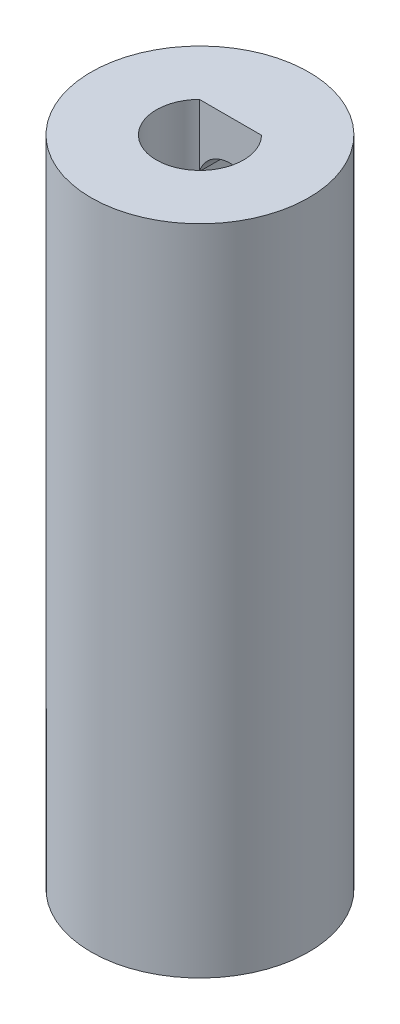
ISO-10303-21;
HEADER;
FILE_DESCRIPTION(('STEP AP214'),'2;1');
FILE_NAME('part.step','',(''),(''),'','','');
FILE_SCHEMA(('AUTOMOTIVE_DESIGN { 1 0 10303 214 1 1 1 1 }'));
ENDSEC;
DATA;
#1=APPLICATION_CONTEXT('core data for automotive mechanical design processes');
#2=APPLICATION_PROTOCOL_DEFINITION('international standard','automotive_design',2000,#1);
#3=PRODUCT_CONTEXT('',#1,'mechanical');
#4=PRODUCT('Part','Part','',(#3));
#5=PRODUCT_RELATED_PRODUCT_CATEGORY('part','',(#4));
#6=PRODUCT_DEFINITION_FORMATION('','',#4);
#7=PRODUCT_DEFINITION_CONTEXT('part definition',#1,'design');
#8=PRODUCT_DEFINITION('design','',#6,#7);
#9=PRODUCT_DEFINITION_SHAPE('','',#8);
#10=(LENGTH_UNIT() NAMED_UNIT(*) SI_UNIT(.MILLI.,.METRE.));
#11=(NAMED_UNIT(*) PLANE_ANGLE_UNIT() SI_UNIT($,.RADIAN.));
#12=(NAMED_UNIT(*) SI_UNIT($,.STERADIAN.) SOLID_ANGLE_UNIT());
#13=UNCERTAINTY_MEASURE_WITH_UNIT(LENGTH_MEASURE(1.E-05),#10,'distance_accuracy_value','');
#14=(GEOMETRIC_REPRESENTATION_CONTEXT(3) GLOBAL_UNCERTAINTY_ASSIGNED_CONTEXT((#13)) GLOBAL_UNIT_ASSIGNED_CONTEXT((#10,
#11,#12)) REPRESENTATION_CONTEXT('',''));
#15=CARTESIAN_POINT('',(0.,0.,0.));
#16=DIRECTION('',(0.,0.,1.));
#17=DIRECTION('',(1.,0.,0.));
#18=AXIS2_PLACEMENT_3D('',#15,#16,#17);
#19=CARTESIAN_POINT('',(0.,0.,-1.4));
#20=DIRECTION('',(0.,0.,1.));
#21=DIRECTION('',(1.,0.,0.));
#22=AXIS2_PLACEMENT_3D('',#19,#20,#21);
#23=PLANE('',#22);
#24=CARTESIAN_POINT('',(0.,26.6692047122861,-1.4));
#25=DIRECTION('',(0.,0.,1.));
#26=DIRECTION('',(1.,0.,0.));
#27=AXIS2_PLACEMENT_3D('',#24,#25,#26);
#28=CIRCLE('',#27,1.5);
#29=CARTESIAN_POINT('',(-1.42828568570857,26.2109471427905,-1.4));
#30=VERTEX_POINT('',#29);
#31=CARTESIAN_POINT('',(1.42828568570857,26.2109471427905,-1.4));
#32=VERTEX_POINT('',#31);
#33=EDGE_CURVE('E108',#30,#32,#28,.T.);
#34=ORIENTED_EDGE('',*,*,#33,.F.);
#35=DIRECTION('',(0.,1.,0.));
#36=VECTOR('',#35,1.);
#37=CARTESIAN_POINT('',(-1.42828568570857,0.,-1.4));
#38=LINE('',#37,#36);
#39=CARTESIAN_POINT('',(-1.42828568570857,0.,-1.4));
#40=VERTEX_POINT('',#39);
#41=EDGE_CURVE('E196',#40,#30,#38,.T.);
#42=ORIENTED_EDGE('',*,*,#41,.F.);
#43=DIRECTION('',(1.,0.,0.));
#44=VECTOR('',#43,1.);
#45=CARTESIAN_POINT('',(0.,0.,-1.4));
#46=LINE('',#45,#44);
#47=CARTESIAN_POINT('',(1.42828568570857,0.,-1.4));
#48=VERTEX_POINT('',#47);
#49=EDGE_CURVE('E216',#40,#48,#46,.T.);
#50=ORIENTED_EDGE('',*,*,#49,.T.);
#51=DIRECTION('',(0.,1.,0.));
#52=VECTOR('',#51,1.);
#53=CARTESIAN_POINT('',(1.42828568570857,0.,-1.4));
#54=LINE('',#53,#52);
#55=EDGE_CURVE('E198',#48,#32,#54,.T.);
#56=ORIENTED_EDGE('',*,*,#55,.T.);
#57=EDGE_LOOP('',(#34,#42,#50,#56));
#58=FACE_BOUND('',#57,.T.);
#59=ADVANCED_FACE('F45',(#58),#23,.T.);
#60=CARTESIAN_POINT('',(0.,30.,0.));
#61=DIRECTION('',(0.,-1.,0.));
#62=DIRECTION('',(0.,0.,-1.));
#63=AXIS2_PLACEMENT_3D('',#60,#61,#62);
#64=CYLINDRICAL_SURFACE('',#63,5.);
#65=CARTESIAN_POINT('',(1.42828568570857,26.2109471427905,-4.79165942028437));
#66=CARTESIAN_POINT('',(1.41532086952665,26.1705391653264,-4.79552145997788));
#67=CARTESIAN_POINT('',(1.40066067903154,26.1307439398568,-4.79983662152926));
#68=CARTESIAN_POINT('',(1.36807036176014,26.0526207136702,-4.80922828737008));
#69=CARTESIAN_POINT('',(1.35014109854961,26.0142923286967,-4.81430459053184));
#70=CARTESIAN_POINT('',(1.29170054599167,25.9019946025929,-4.83043898220411));
#71=CARTESIAN_POINT('',(1.24648142779986,25.8305422753068,-4.84241986157132));
#72=CARTESIAN_POINT('',(1.14488022710476,25.6964065708847,-4.86744056186554));
#73=CARTESIAN_POINT('',(1.08850299972657,25.6337194000205,-4.88047992077565));
#74=CARTESIAN_POINT('',(0.966002047538882,25.5185955596391,-4.90619515458798));
#75=CARTESIAN_POINT('',(0.899876843650885,25.4661604484995,-4.91887097398041));
#76=CARTESIAN_POINT('',(0.758581148789905,25.3723452937152,-4.94264604117125));
#77=CARTESIAN_POINT('',(0.683298525900501,25.3311276223409,-4.95372114501679));
#78=CARTESIAN_POINT('',(0.526479688668817,25.2620246788735,-4.97283095910141));
#79=CARTESIAN_POINT('',(0.444944593288869,25.2341370276296,-4.98086621184175));
#80=CARTESIAN_POINT('',(0.280381908805703,25.193274739882,-4.99279445763981));
#81=CARTESIAN_POINT('',(0.197461577395029,25.1799010129168,-4.99679807180051));
#82=CARTESIAN_POINT('',(0.0304659141714283,25.1671794327191,-5.00060404382434));
#83=CARTESIAN_POINT('',(-0.0536091366120107,25.1678282251574,-5.00040740643043));
#84=CARTESIAN_POINT('',(-0.217666675765226,25.1828702942957,-4.99591272381006));
#85=CARTESIAN_POINT('',(-0.297693890851032,25.1968215697753,-4.99174657660499));
#86=CARTESIAN_POINT('',(-0.454211764306284,25.2373430500535,-4.97994525011857));
#87=CARTESIAN_POINT('',(-0.530702260612382,25.2639138324893,-4.97230991204141));
#88=CARTESIAN_POINT('',(-0.678973505373156,25.3291931712204,-4.95425471734346));
#89=CARTESIAN_POINT('',(-0.750692666240752,25.3680329757042,-4.94380494026372));
#90=CARTESIAN_POINT('',(-0.88674959128624,25.4566575195405,-4.92122333442324));
#91=CARTESIAN_POINT('',(-0.951084081152311,25.5064470856296,-4.90909076474877));
#92=CARTESIAN_POINT('',(-1.07317331059456,25.6178276925028,-4.88388570248044));
#93=CARTESIAN_POINT('',(-1.13057312751665,25.6798035745167,-4.87079500680452));
#94=CARTESIAN_POINT('',(-1.23421512254996,25.8125894471405,-4.84557141891695));
#95=CARTESIAN_POINT('',(-1.28046900732324,25.883390049402,-4.83343753085693));
#96=CARTESIAN_POINT('',(-1.34225855491378,25.998046379778,-4.81651873666881));
#97=CARTESIAN_POINT('',(-1.36218461691526,26.0394693978725,-4.81090552773059));
#98=CARTESIAN_POINT('',(-1.39816471282082,26.1240053124375,-4.80057050874069));
#99=CARTESIAN_POINT('',(-1.4142237736363,26.1671159293775,-4.79584754317136));
#100=CARTESIAN_POINT('',(-1.42828568570857,26.2109471427905,-4.79165942028437));
#101=B_SPLINE_CURVE_WITH_KNOTS('',3,(#65,#66,#67,#68,#69,#70,#71,#72,#73,#74,#75,#76,#77,#78,
#79,#80,#81,#82,#83,#84,#85,#86,#87,#88,#89,#90,#91,#92,#93,#94,#95,#96,#97,#98,#99,#100),
.UNSPECIFIED.,.F.,.F.,(4,2,2,2,2,2,2,2,2,2,2,2,2,2,2,2,2,4),(0.,0.127750640272878,
0.255467582407862,0.510368744181928,0.765159236043947,1.01998842760596,1.27833072738271,
1.53662690081808,1.78762516381199,2.038563386137,2.28144403871632,2.52433580982782,
2.76991931923274,3.01561130144124,3.27089500582826,3.52590940347394,3.6646536494105,
3.80321654901352),.UNSPECIFIED.);
#102=CARTESIAN_POINT('',(1.42828568570857,26.2109471427905,-4.79165942028437));
#103=VERTEX_POINT('',#102);
#104=CARTESIAN_POINT('',(-1.42828568570857,26.2109471427905,-4.79165942028437));
#105=VERTEX_POINT('',#104);
#106=EDGE_CURVE('E120',#103,#105,#101,.T.);
#107=ORIENTED_EDGE('',*,*,#106,.F.);
#108=DIRECTION('',(0.,-1.,0.));
#109=VECTOR('',#108,1.);
#110=CARTESIAN_POINT('',(1.42828568570857,30.,-4.79165942028437));
#111=LINE('',#110,#109);
#112=CARTESIAN_POINT('',(1.42828568570857,27.1274622817817,-4.79165942028437));
#113=VERTEX_POINT('',#112);
#114=EDGE_CURVE('E101',#113,#103,#111,.T.);
#115=ORIENTED_EDGE('',*,*,#114,.F.);
#116=CARTESIAN_POINT('',(-1.42828568570857,27.1274622817817,-4.79165942028437));
#117=CARTESIAN_POINT('',(-1.41532086952665,27.1678702592459,-4.79552145997788));
#118=CARTESIAN_POINT('',(-1.40066067903154,27.2076654847154,-4.79983662152926));
#119=CARTESIAN_POINT('',(-1.36807036176014,27.285788710902,-4.80922828737008));
#120=CARTESIAN_POINT('',(-1.35014109854961,27.3241170958755,-4.81430459053184));
#121=CARTESIAN_POINT('',(-1.29170054599167,27.4364148219794,-4.83043898220411));
#122=CARTESIAN_POINT('',(-1.24648142779986,27.5078671492654,-4.84241986157132));
#123=CARTESIAN_POINT('',(-1.14488022710476,27.6420028536875,-4.86744056186553));
#124=CARTESIAN_POINT('',(-1.08850299972657,27.7046900245517,-4.88047992077564));
#125=CARTESIAN_POINT('',(-0.966002047538883,27.8198138649331,-4.90619515458798));
#126=CARTESIAN_POINT('',(-0.899876843650886,27.8722489760728,-4.91887097398041));
#127=CARTESIAN_POINT('',(-0.758581148789906,27.966064130857,-4.94264604117125));
#128=CARTESIAN_POINT('',(-0.683298525900503,28.0072818022314,-4.95372114501679));
#129=CARTESIAN_POINT('',(-0.52647968866882,28.0763847456987,-4.97283095910141));
#130=CARTESIAN_POINT('',(-0.444944593288873,28.1042723969427,-4.98086621184175));
#131=CARTESIAN_POINT('',(-0.280381908805708,28.1451346846903,-4.99279445763981));
#132=CARTESIAN_POINT('',(-0.197461577395034,28.1585084116554,-4.99679807180051));
#133=CARTESIAN_POINT('',(-0.0304659141714334,28.1712299918532,-5.00060404382434));
#134=CARTESIAN_POINT('',(0.0536091366120056,28.1705811994148,-5.00040740643043));
#135=CARTESIAN_POINT('',(0.21766667576522,28.1555391302765,-4.99591272381006));
#136=CARTESIAN_POINT('',(0.297693890851026,28.141587854797,-4.99174657660499));
#137=CARTESIAN_POINT('',(0.454211764306279,28.1010663745187,-4.97994525011857));
#138=CARTESIAN_POINT('',(0.530702260612376,28.0744955920829,-4.97230991204141));
#139=CARTESIAN_POINT('',(0.678973505373151,28.0092162533519,-4.95425471734346));
#140=CARTESIAN_POINT('',(0.750692666240747,27.9703764488681,-4.94380494026372));
#141=CARTESIAN_POINT('',(0.886749591286235,27.8817519050317,-4.92122333442324));
#142=CARTESIAN_POINT('',(0.951084081152306,27.8319623389427,-4.90909076474877));
#143=CARTESIAN_POINT('',(1.07317331059455,27.7205817320694,-4.88388570248044));
#144=CARTESIAN_POINT('',(1.13057312751664,27.6586058500556,-4.87079500680452));
#145=CARTESIAN_POINT('',(1.23421512254996,27.5258199774318,-4.84557141891695));
#146=CARTESIAN_POINT('',(1.28046900732324,27.4550193751703,-4.83343753085693));
#147=CARTESIAN_POINT('',(1.34225855491378,27.3403630447943,-4.81651873666881));
#148=CARTESIAN_POINT('',(1.36218461691526,27.2989400266998,-4.81090552773059));
#149=CARTESIAN_POINT('',(1.39816471282082,27.2144041121348,-4.80057050874069));
#150=CARTESIAN_POINT('',(1.4142237736363,27.1712934951948,-4.79584754317136));
#151=CARTESIAN_POINT('',(1.42828568570857,27.1274622817817,-4.79165942028437));
#152=B_SPLINE_CURVE_WITH_KNOTS('',3,(#116,#117,#118,#119,#120,#121,#122,#123,#124,#125,#126,
#127,#128,#129,#130,#131,#132,#133,#134,#135,#136,#137,#138,#139,#140,#141,#142,#143,#144,#145,
#146,#147,#148,#149,#150,#151),.UNSPECIFIED.,.F.,.F.,(4,2,2,2,2,2,2,2,2,2,2,2,2,2,2,2,2,4),(0.,
0.127750640272875,0.255467582407862,0.510368744181924,0.765159236043946,1.01998842760596,
1.27833072738271,1.53662690081808,1.78762516381199,2.03856338613699,2.28144403871631,
2.52433580982782,2.76991931923273,3.01561130144124,3.27089500582826,3.52590940347394,
3.6646536494105,3.80321654901352),.UNSPECIFIED.);
#153=CARTESIAN_POINT('',(-1.42828568570857,27.1274622817817,-4.79165942028437));
#154=VERTEX_POINT('',#153);
#155=EDGE_CURVE('E111',#154,#113,#152,.T.);
#156=ORIENTED_EDGE('',*,*,#155,.F.);
#157=DIRECTION('',(0.,-1.,0.));
#158=VECTOR('',#157,1.);
#159=CARTESIAN_POINT('',(-1.42828568570857,30.,-4.79165942028437));
#160=LINE('',#159,#158);
#161=EDGE_CURVE('E61',#105,#154,#160,.F.);
#162=ORIENTED_EDGE('',*,*,#161,.F.);
#163=EDGE_LOOP('',(#107,#115,#156,#162));
#164=FACE_BOUND('',#163,.T.);
#165=CARTESIAN_POINT('',(0.,30.,0.));
#166=DIRECTION('',(0.,1.,0.));
#167=DIRECTION('',(0.,0.,1.));
#168=AXIS2_PLACEMENT_3D('',#165,#166,#167);
#169=CIRCLE('',#168,5.);
#170=CARTESIAN_POINT('',(0.,30.,5.));
#171=VERTEX_POINT('',#170);
#172=EDGE_CURVE('E11',#171,#171,#169,.T.);
#173=ORIENTED_EDGE('',*,*,#172,.F.);
#174=EDGE_LOOP('',(#173));
#175=FACE_BOUND('',#174,.T.);
#176=CARTESIAN_POINT('',(0.,0.,0.));
#177=DIRECTION('',(0.,1.,0.));
#178=DIRECTION('',(0.,0.,1.));
#179=AXIS2_PLACEMENT_3D('',#176,#177,#178);
#180=CIRCLE('',#179,5.);
#181=CARTESIAN_POINT('',(0.,0.,5.));
#182=VERTEX_POINT('',#181);
#183=EDGE_CURVE('E49',#182,#182,#180,.T.);
#184=ORIENTED_EDGE('',*,*,#183,.T.);
#185=EDGE_LOOP('',(#184));
#186=FACE_BOUND('',#185,.T.);
#187=ADVANCED_FACE('F47',(#164,#175,#186),#64,.T.);
#188=CARTESIAN_POINT('',(0.,30.,0.));
#189=DIRECTION('',(0.,1.,0.));
#190=DIRECTION('',(0.,0.,1.));
#191=AXIS2_PLACEMENT_3D('',#188,#189,#190);
#192=PLANE('',#191);
#193=CARTESIAN_POINT('',(0.,30.,0.));
#194=DIRECTION('',(0.,1.,0.));
#195=DIRECTION('',(0.,0.,1.));
#196=AXIS2_PLACEMENT_3D('',#193,#194,#195);
#197=CIRCLE('',#196,2.);
#198=CARTESIAN_POINT('',(-1.42828568570857,30.,-1.4));
#199=VERTEX_POINT('',#198);
#200=CARTESIAN_POINT('',(1.42828568570857,30.,-1.4));
#201=VERTEX_POINT('',#200);
#202=EDGE_CURVE('E115',#199,#201,#197,.T.);
#203=ORIENTED_EDGE('',*,*,#202,.F.);
#204=DIRECTION('',(1.,0.,0.));
#205=VECTOR('',#204,1.);
#206=CARTESIAN_POINT('',(0.,30.,-1.4));
#207=LINE('',#206,#205);
#208=EDGE_CURVE('E211',#199,#201,#207,.T.);
#209=ORIENTED_EDGE('',*,*,#208,.T.);
#210=EDGE_LOOP('',(#203,#209));
#211=FACE_BOUND('',#210,.T.);
#212=ORIENTED_EDGE('',*,*,#172,.T.);
#213=EDGE_LOOP('',(#212));
#214=FACE_BOUND('',#213,.T.);
#215=ADVANCED_FACE('F177',(#211,#214),#192,.T.);
#216=CARTESIAN_POINT('',(0.,0.,0.));
#217=DIRECTION('',(0.,1.,0.));
#218=DIRECTION('',(0.,0.,1.));
#219=AXIS2_PLACEMENT_3D('',#216,#217,#218);
#220=PLANE('',#219);
#221=ORIENTED_EDGE('',*,*,#49,.F.);
#222=CARTESIAN_POINT('',(0.,0.,0.));
#223=DIRECTION('',(0.,1.,0.));
#224=DIRECTION('',(0.,0.,1.));
#225=AXIS2_PLACEMENT_3D('',#222,#223,#224);
#226=CIRCLE('',#225,2.);
#227=EDGE_CURVE('E153',#40,#48,#226,.T.);
#228=ORIENTED_EDGE('',*,*,#227,.T.);
#229=EDGE_LOOP('',(#221,#228));
#230=FACE_BOUND('',#229,.T.);
#231=ORIENTED_EDGE('',*,*,#183,.F.);
#232=EDGE_LOOP('',(#231));
#233=FACE_BOUND('',#232,.T.);
#234=ADVANCED_FACE('F175',(#230,#233),#220,.F.);
#235=CARTESIAN_POINT('',(0.,0.,0.));
#236=DIRECTION('',(0.,1.,0.));
#237=DIRECTION('',(0.,0.,1.));
#238=AXIS2_PLACEMENT_3D('',#235,#236,#237);
#239=CYLINDRICAL_SURFACE('',#238,2.);
#240=ORIENTED_EDGE('',*,*,#202,.T.);
#241=CARTESIAN_POINT('',(1.42828568570857,27.1274622817817,-1.4));
#242=VERTEX_POINT('',#241);
#243=EDGE_CURVE('E214',#242,#201,#54,.T.);
#244=ORIENTED_EDGE('',*,*,#243,.F.);
#245=DIRECTION('',(0.,1.,0.));
#246=VECTOR('',#245,1.);
#247=CARTESIAN_POINT('',(1.42828568570857,0.,-1.4));
#248=LINE('',#247,#246);
#249=EDGE_CURVE('E69',#32,#242,#248,.T.);
#250=ORIENTED_EDGE('',*,*,#249,.F.);
#251=ORIENTED_EDGE('',*,*,#55,.F.);
#252=ORIENTED_EDGE('',*,*,#227,.F.);
#253=ORIENTED_EDGE('',*,*,#41,.T.);
#254=DIRECTION('',(0.,-1.,0.));
#255=VECTOR('',#254,1.);
#256=CARTESIAN_POINT('',(-1.42828568570857,0.,-1.4));
#257=LINE('',#256,#255);
#258=CARTESIAN_POINT('',(-1.42828568570857,27.1274622817817,-1.4));
#259=VERTEX_POINT('',#258);
#260=EDGE_CURVE('E138',#259,#30,#257,.T.);
#261=ORIENTED_EDGE('',*,*,#260,.F.);
#262=EDGE_CURVE('E204',#259,#199,#38,.T.);
#263=ORIENTED_EDGE('',*,*,#262,.T.);
#264=EDGE_LOOP('',(#240,#244,#250,#251,#252,#253,#261,#263));
#265=FACE_BOUND('',#264,.T.);
#266=ADVANCED_FACE('F171',(#265),#239,.F.);
#267=EDGE_CURVE('E125',#242,#259,#28,.T.);
#268=ORIENTED_EDGE('',*,*,#267,.F.);
#269=ORIENTED_EDGE('',*,*,#243,.T.);
#270=ORIENTED_EDGE('',*,*,#208,.F.);
#271=ORIENTED_EDGE('',*,*,#262,.F.);
#272=EDGE_LOOP('',(#268,#269,#270,#271));
#273=FACE_BOUND('',#272,.T.);
#274=ADVANCED_FACE('F168',(#273),#23,.T.);
#275=CARTESIAN_POINT('',(1.42828568570857,0.,-5.001));
#276=DIRECTION('',(1.,0.,0.));
#277=DIRECTION('',(0.,0.,-1.));
#278=AXIS2_PLACEMENT_3D('',#275,#276,#277);
#279=PLANE('',#278);
#280=ORIENTED_EDGE('',*,*,#114,.T.);
#281=DIRECTION('',(0.,0.,1.));
#282=VECTOR('',#281,1.);
#283=CARTESIAN_POINT('',(1.42828568570857,26.2109471427905,-5.001));
#284=LINE('',#283,#282);
#285=EDGE_CURVE('E116',#103,#32,#284,.T.);
#286=ORIENTED_EDGE('',*,*,#285,.T.);
#287=ORIENTED_EDGE('',*,*,#249,.T.);
#288=DIRECTION('',(0.,0.,1.));
#289=VECTOR('',#288,1.);
#290=CARTESIAN_POINT('',(1.42828568570857,27.1274622817817,-5.001));
#291=LINE('',#290,#289);
#292=EDGE_CURVE('E97',#113,#242,#291,.T.);
#293=ORIENTED_EDGE('',*,*,#292,.F.);
#294=EDGE_LOOP('',(#280,#286,#287,#293));
#295=FACE_BOUND('',#294,.T.);
#296=ADVANCED_FACE('F99',(#295),#279,.F.);
#297=CARTESIAN_POINT('',(0.,26.6692047122861,-5.001));
#298=DIRECTION('',(0.,0.,1.));
#299=DIRECTION('',(1.,0.,0.));
#300=AXIS2_PLACEMENT_3D('',#297,#298,#299);
#301=CYLINDRICAL_SURFACE('',#300,1.5);
#302=ORIENTED_EDGE('',*,*,#106,.T.);
#303=DIRECTION('',(0.,0.,1.));
#304=VECTOR('',#303,1.);
#305=CARTESIAN_POINT('',(-1.42828568570857,26.2109471427905,-5.001));
#306=LINE('',#305,#304);
#307=EDGE_CURVE('E144',#105,#30,#306,.T.);
#308=ORIENTED_EDGE('',*,*,#307,.T.);
#309=ORIENTED_EDGE('',*,*,#33,.T.);
#310=ORIENTED_EDGE('',*,*,#285,.F.);
#311=EDGE_LOOP('',(#302,#308,#309,#310));
#312=FACE_BOUND('',#311,.T.);
#313=ADVANCED_FACE('F155',(#312),#301,.F.);
#314=CARTESIAN_POINT('',(-1.42828568570857,0.,-5.001));
#315=DIRECTION('',(-1.,0.,0.));
#316=DIRECTION('',(0.,0.,1.));
#317=AXIS2_PLACEMENT_3D('',#314,#315,#316);
#318=PLANE('',#317);
#319=ORIENTED_EDGE('',*,*,#161,.T.);
#320=DIRECTION('',(0.,0.,1.));
#321=VECTOR('',#320,1.);
#322=CARTESIAN_POINT('',(-1.42828568570857,27.1274622817817,-5.001));
#323=LINE('',#322,#321);
#324=EDGE_CURVE('E107',#154,#259,#323,.T.);
#325=ORIENTED_EDGE('',*,*,#324,.T.);
#326=ORIENTED_EDGE('',*,*,#260,.T.);
#327=ORIENTED_EDGE('',*,*,#307,.F.);
#328=EDGE_LOOP('',(#319,#325,#326,#327));
#329=FACE_BOUND('',#328,.T.);
#330=ADVANCED_FACE('F161',(#329),#318,.F.);
#331=ORIENTED_EDGE('',*,*,#155,.T.);
#332=ORIENTED_EDGE('',*,*,#292,.T.);
#333=ORIENTED_EDGE('',*,*,#267,.T.);
#334=ORIENTED_EDGE('',*,*,#324,.F.);
#335=EDGE_LOOP('',(#331,#332,#333,#334));
#336=FACE_BOUND('',#335,.T.);
#337=ADVANCED_FACE('F112',(#336),#301,.F.);
#338=CLOSED_SHELL('',(#59,#187,#215,#234,#266,#274,#296,#313,#330,#337));
#339=MANIFOLD_SOLID_BREP('B2',#338);
#340=ADVANCED_BREP_SHAPE_REPRESENTATION('',(#18,#339),#14);
#341=SHAPE_DEFINITION_REPRESENTATION(#9,#340);
ENDSEC;
END-ISO-10303-21;
